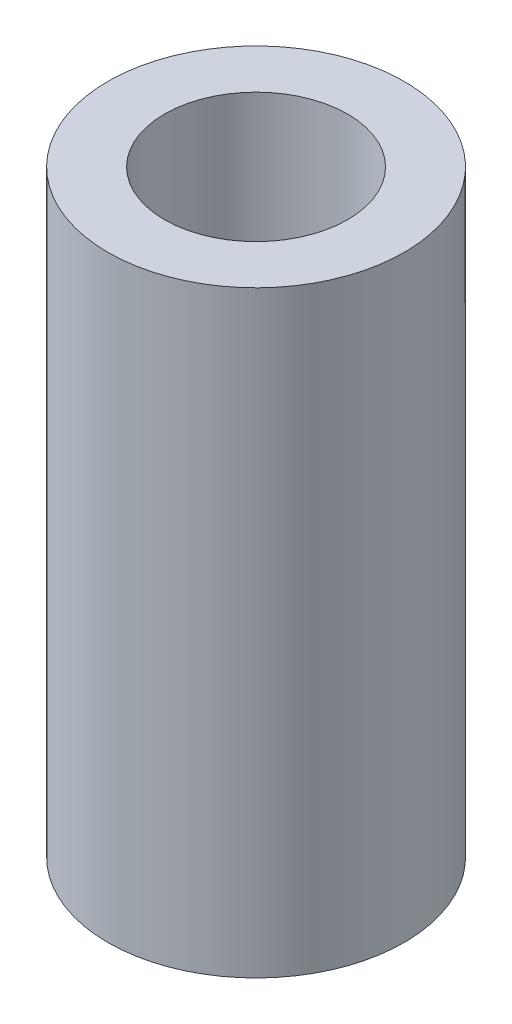
ISO-10303-21;
HEADER;
FILE_DESCRIPTION(('STEP AP214'),'2;1');
FILE_NAME('part.step','',(''),(''),'','','');
FILE_SCHEMA(('AUTOMOTIVE_DESIGN { 1 0 10303 214 1 1 1 1 }'));
ENDSEC;
DATA;
#1=APPLICATION_CONTEXT('core data for automotive mechanical design processes');
#2=APPLICATION_PROTOCOL_DEFINITION('international standard','automotive_design',2000,#1);
#3=PRODUCT_CONTEXT('',#1,'mechanical');
#4=PRODUCT('Part','Part','',(#3));
#5=PRODUCT_RELATED_PRODUCT_CATEGORY('part','',(#4));
#6=PRODUCT_DEFINITION_FORMATION('','',#4);
#7=PRODUCT_DEFINITION_CONTEXT('part definition',#1,'design');
#8=PRODUCT_DEFINITION('design','',#6,#7);
#9=PRODUCT_DEFINITION_SHAPE('','',#8);
#10=(LENGTH_UNIT() NAMED_UNIT(*) SI_UNIT(.MILLI.,.METRE.));
#11=(NAMED_UNIT(*) PLANE_ANGLE_UNIT() SI_UNIT($,.RADIAN.));
#12=(NAMED_UNIT(*) SI_UNIT($,.STERADIAN.) SOLID_ANGLE_UNIT());
#13=UNCERTAINTY_MEASURE_WITH_UNIT(LENGTH_MEASURE(1.E-05),#10,'distance_accuracy_value','');
#14=(GEOMETRIC_REPRESENTATION_CONTEXT(3) GLOBAL_UNCERTAINTY_ASSIGNED_CONTEXT((#13)) GLOBAL_UNIT_ASSIGNED_CONTEXT((#10,
#11,#12)) REPRESENTATION_CONTEXT('',''));
#15=CARTESIAN_POINT('',(0.,0.,0.));
#16=DIRECTION('',(0.,0.,1.));
#17=DIRECTION('',(1.,0.,0.));
#18=AXIS2_PLACEMENT_3D('',#15,#16,#17);
#19=CARTESIAN_POINT('',(0.,21.1346,0.));
#20=DIRECTION('',(0.,1.,0.));
#21=DIRECTION('',(0.,0.,1.));
#22=AXIS2_PLACEMENT_3D('',#19,#20,#21);
#23=PLANE('',#22);
#24=CARTESIAN_POINT('',(0.,21.1346,0.));
#25=DIRECTION('',(0.,1.,0.));
#26=DIRECTION('',(0.,0.,1.));
#27=AXIS2_PLACEMENT_3D('',#24,#25,#26);
#28=CIRCLE('',#27,5.2375);
#29=CARTESIAN_POINT('',(0.,21.1346,5.2375));
#30=VERTEX_POINT('',#29);
#31=EDGE_CURVE('E11',#30,#30,#28,.T.);
#32=ORIENTED_EDGE('',*,*,#31,.T.);
#33=EDGE_LOOP('',(#32));
#34=FACE_BOUND('',#33,.T.);
#35=CARTESIAN_POINT('',(0.,21.1346,0.));
#36=DIRECTION('',(0.,1.,0.));
#37=DIRECTION('',(0.,0.,1.));
#38=AXIS2_PLACEMENT_3D('',#35,#36,#37);
#39=CIRCLE('',#38,3.2375);
#40=CARTESIAN_POINT('',(0.,21.1346,3.2375));
#41=VERTEX_POINT('',#40);
#42=EDGE_CURVE('E52',#41,#41,#39,.T.);
#43=ORIENTED_EDGE('',*,*,#42,.F.);
#44=EDGE_LOOP('',(#43));
#45=FACE_BOUND('',#44,.T.);
#46=ADVANCED_FACE('F41',(#34,#45),#23,.T.);
#47=CARTESIAN_POINT('',(0.,0.,0.));
#48=DIRECTION('',(0.,1.,0.));
#49=DIRECTION('',(0.,0.,1.));
#50=AXIS2_PLACEMENT_3D('',#47,#48,#49);
#51=PLANE('',#50);
#52=CARTESIAN_POINT('',(0.,0.,0.));
#53=DIRECTION('',(0.,1.,0.));
#54=DIRECTION('',(0.,0.,1.));
#55=AXIS2_PLACEMENT_3D('',#52,#53,#54);
#56=CIRCLE('',#55,5.2375);
#57=CARTESIAN_POINT('',(0.,0.,5.2375));
#58=VERTEX_POINT('',#57);
#59=EDGE_CURVE('E45',#58,#58,#56,.T.);
#60=ORIENTED_EDGE('',*,*,#59,.F.);
#61=EDGE_LOOP('',(#60));
#62=FACE_BOUND('',#61,.T.);
#63=CARTESIAN_POINT('',(0.,0.,0.));
#64=DIRECTION('',(0.,1.,0.));
#65=DIRECTION('',(0.,0.,1.));
#66=AXIS2_PLACEMENT_3D('',#63,#64,#65);
#67=CIRCLE('',#66,3.2375);
#68=CARTESIAN_POINT('',(0.,0.,3.2375));
#69=VERTEX_POINT('',#68);
#70=EDGE_CURVE('E54',#69,#69,#67,.T.);
#71=ORIENTED_EDGE('',*,*,#70,.T.);
#72=EDGE_LOOP('',(#71));
#73=FACE_BOUND('',#72,.T.);
#74=ADVANCED_FACE('F64',(#62,#73),#51,.F.);
#75=CARTESIAN_POINT('',(0.,21.1346,0.));
#76=DIRECTION('',(0.,-1.,0.));
#77=DIRECTION('',(0.,0.,-1.));
#78=AXIS2_PLACEMENT_3D('',#75,#76,#77);
#79=CYLINDRICAL_SURFACE('',#78,5.2375);
#80=ORIENTED_EDGE('',*,*,#31,.F.);
#81=EDGE_LOOP('',(#80));
#82=FACE_BOUND('',#81,.T.);
#83=ORIENTED_EDGE('',*,*,#59,.T.);
#84=EDGE_LOOP('',(#83));
#85=FACE_BOUND('',#84,.T.);
#86=ADVANCED_FACE('F43',(#82,#85),#79,.T.);
#87=CARTESIAN_POINT('',(0.,21.1346,0.));
#88=DIRECTION('',(0.,-1.,0.));
#89=DIRECTION('',(0.,0.,-1.));
#90=AXIS2_PLACEMENT_3D('',#87,#88,#89);
#91=CYLINDRICAL_SURFACE('',#90,3.2375);
#92=ORIENTED_EDGE('',*,*,#42,.T.);
#93=EDGE_LOOP('',(#92));
#94=FACE_BOUND('',#93,.T.);
#95=ORIENTED_EDGE('',*,*,#70,.F.);
#96=EDGE_LOOP('',(#95));
#97=FACE_BOUND('',#96,.T.);
#98=ADVANCED_FACE('F60',(#94,#97),#91,.F.);
#99=CLOSED_SHELL('',(#46,#74,#86,#98));
#100=MANIFOLD_SOLID_BREP('B2',#99);
#101=ADVANCED_BREP_SHAPE_REPRESENTATION('',(#18,#100),#14);
#102=SHAPE_DEFINITION_REPRESENTATION(#9,#101);
ENDSEC;
END-ISO-10303-21;
